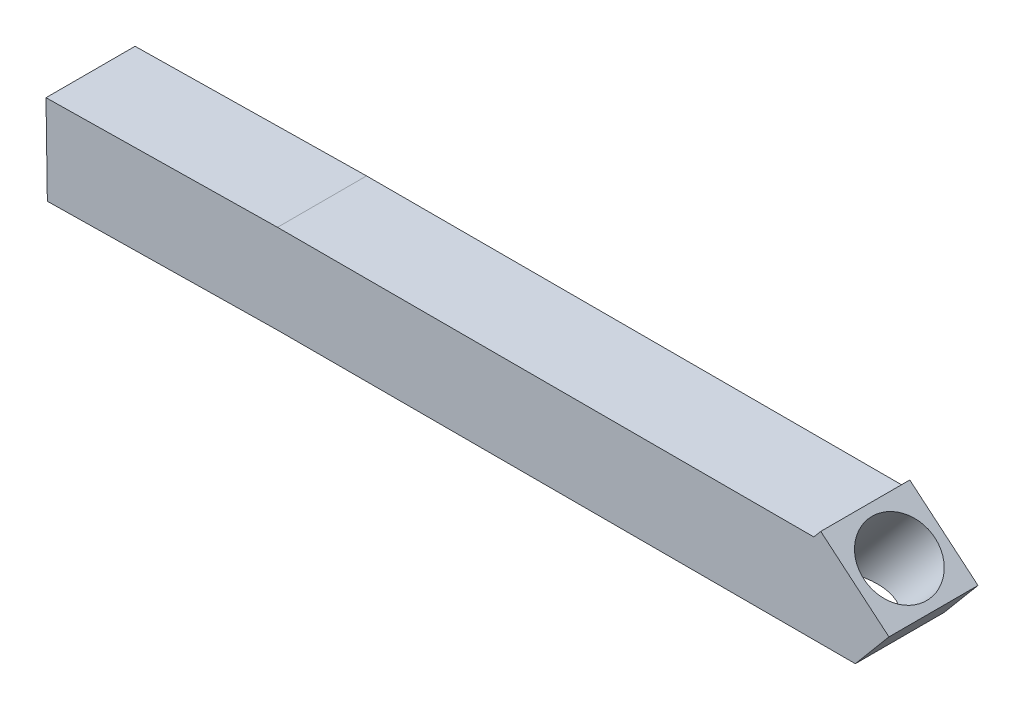
ISO-10303-21;
HEADER;
FILE_DESCRIPTION(('STEP AP214'),'2;1');
FILE_NAME('part.step','',(''),(''),'','','');
FILE_SCHEMA(('AUTOMOTIVE_DESIGN { 1 0 10303 214 1 1 1 1 }'));
ENDSEC;
DATA;
#1=APPLICATION_CONTEXT('core data for automotive mechanical design processes');
#2=APPLICATION_PROTOCOL_DEFINITION('international standard','automotive_design',2000,#1);
#3=PRODUCT_CONTEXT('',#1,'mechanical');
#4=PRODUCT('Part','Part','',(#3));
#5=PRODUCT_RELATED_PRODUCT_CATEGORY('part','',(#4));
#6=PRODUCT_DEFINITION_FORMATION('','',#4);
#7=PRODUCT_DEFINITION_CONTEXT('part definition',#1,'design');
#8=PRODUCT_DEFINITION('design','',#6,#7);
#9=PRODUCT_DEFINITION_SHAPE('','',#8);
#10=(LENGTH_UNIT() NAMED_UNIT(*) SI_UNIT(.MILLI.,.METRE.));
#11=(NAMED_UNIT(*) PLANE_ANGLE_UNIT() SI_UNIT($,.RADIAN.));
#12=(NAMED_UNIT(*) SI_UNIT($,.STERADIAN.) SOLID_ANGLE_UNIT());
#13=UNCERTAINTY_MEASURE_WITH_UNIT(LENGTH_MEASURE(1.E-05),#10,'distance_accuracy_value','');
#14=(GEOMETRIC_REPRESENTATION_CONTEXT(3) GLOBAL_UNCERTAINTY_ASSIGNED_CONTEXT((#13)) GLOBAL_UNIT_ASSIGNED_CONTEXT((#10,
#11,#12)) REPRESENTATION_CONTEXT('',''));
#15=CARTESIAN_POINT('',(0.,0.,0.));
#16=DIRECTION('',(0.,0.,1.));
#17=DIRECTION('',(1.,0.,0.));
#18=AXIS2_PLACEMENT_3D('',#15,#16,#17);
#19=CARTESIAN_POINT('',(0.,0.,2.5));
#20=DIRECTION('',(0.,0.,1.));
#21=DIRECTION('',(1.,0.,0.));
#22=AXIS2_PLACEMENT_3D('',#19,#20,#21);
#23=PLANE('',#22);
#24=DIRECTION('',(-1.,0.,0.));
#25=VECTOR('',#24,1.);
#26=CARTESIAN_POINT('',(-70.4061726678737,-77.7100601328562,2.5));
#27=LINE('',#26,#25);
#28=CARTESIAN_POINT('',(-55.3504965717444,-77.7100601328562,2.5));
#29=VERTEX_POINT('',#28);
#30=CARTESIAN_POINT('',(-70.4061726678737,-77.7100601328562,2.5));
#31=VERTEX_POINT('',#30);
#32=EDGE_CURVE('E150',#29,#31,#27,.T.);
#33=ORIENTED_EDGE('',*,*,#32,.T.);
#34=DIRECTION('',(0.999885535757896,0.0151299498394764,0.));
#35=VECTOR('',#34,1.);
#36=CARTESIAN_POINT('',(-76.9054286503,-77.8084048068128,2.5));
#37=LINE('',#36,#35);
#38=CARTESIAN_POINT('',(-76.9054286503,-77.8084048068128,2.5));
#39=VERTEX_POINT('',#38);
#40=EDGE_CURVE('E137',#39,#31,#37,.T.);
#41=ORIENTED_EDGE('',*,*,#40,.F.);
#42=DIRECTION('',(-0.0151299498394762,0.999885535757896,0.));
#43=VECTOR('',#42,1.);
#44=CARTESIAN_POINT('',(-76.9054286503,-77.8084048068128,2.5));
#45=LINE('',#44,#43);
#46=CARTESIAN_POINT('',(-76.8676037757013,-80.3081186462075,2.5));
#47=VERTEX_POINT('',#46);
#48=EDGE_CURVE('E117',#47,#39,#45,.T.);
#49=ORIENTED_EDGE('',*,*,#48,.F.);
#50=DIRECTION('',(0.999885535757896,0.0151299498394764,0.));
#51=VECTOR('',#50,1.);
#52=CARTESIAN_POINT('',(-76.8676037757013,-80.3081186462075,2.5));
#53=LINE('',#52,#51);
#54=CARTESIAN_POINT('',(-70.368347793275,-80.2097739722509,2.5));
#55=VERTEX_POINT('',#54);
#56=EDGE_CURVE('E114',#47,#55,#53,.T.);
#57=ORIENTED_EDGE('',*,*,#56,.T.);
#58=DIRECTION('',(1.,0.,0.));
#59=VECTOR('',#58,1.);
#60=CARTESIAN_POINT('',(-70.368347793275,-80.209773972251,2.5));
#61=LINE('',#60,#59);
#62=CARTESIAN_POINT('',(-54.1844873090986,-80.209773972251,2.5));
#63=VERTEX_POINT('',#62);
#64=EDGE_CURVE('E84',#55,#63,#61,.T.);
#65=ORIENTED_EDGE('',*,*,#64,.T.);
#66=DIRECTION('',(0.642787609686536,0.766044443118981,0.));
#67=VECTOR('',#66,1.);
#68=CARTESIAN_POINT('',(-54.1844873090986,-80.209773972251,2.5));
#69=LINE('',#68,#67);
#70=CARTESIAN_POINT('',(-53.2406469454359,-79.0849488280205,2.5));
#71=VERTEX_POINT('',#70);
#72=EDGE_CURVE('E144',#63,#71,#69,.T.);
#73=ORIENTED_EDGE('',*,*,#72,.T.);
#74=DIRECTION('',(-0.766044443118982,0.642787609686535,0.));
#75=VECTOR('',#74,1.);
#76=CARTESIAN_POINT('',(-53.2406469454359,-79.0849488280205,2.5));
#77=LINE('',#76,#75);
#78=CARTESIAN_POINT('',(-55.1557580532333,-77.4779798038041,2.5));
#79=VERTEX_POINT('',#78);
#80=EDGE_CURVE('E147',#71,#79,#77,.T.);
#81=ORIENTED_EDGE('',*,*,#80,.T.);
#82=DIRECTION('',(-0.642787609686532,-0.766044443118984,0.));
#83=VECTOR('',#82,1.);
#84=CARTESIAN_POINT('',(-55.3504965717444,-77.7100601328562,2.5));
#85=LINE('',#84,#83);
#86=EDGE_CURVE('E50',#79,#29,#85,.T.);
#87=ORIENTED_EDGE('',*,*,#86,.T.);
#88=EDGE_LOOP('',(#33,#41,#49,#57,#65,#73,#81,#87));
#89=FACE_BOUND('',#88,.T.);
#90=ADVANCED_FACE('F33',(#89),#23,.T.);
#91=CARTESIAN_POINT('',(0.,0.,0.));
#92=DIRECTION('',(0.,0.,1.));
#93=DIRECTION('',(1.,0.,0.));
#94=AXIS2_PLACEMENT_3D('',#91,#92,#93);
#95=PLANE('',#94);
#96=DIRECTION('',(1.,0.,0.));
#97=VECTOR('',#96,1.);
#98=CARTESIAN_POINT('',(-70.368347793275,-80.209773972251,0.));
#99=LINE('',#98,#97);
#100=CARTESIAN_POINT('',(-70.368347793275,-80.209773972251,0.));
#101=VERTEX_POINT('',#100);
#102=CARTESIAN_POINT('',(-54.1844873090986,-80.209773972251,0.));
#103=VERTEX_POINT('',#102);
#104=EDGE_CURVE('E131',#101,#103,#99,.T.);
#105=ORIENTED_EDGE('',*,*,#104,.F.);
#106=DIRECTION('',(0.999885535757896,0.0151299498394764,0.));
#107=VECTOR('',#106,1.);
#108=CARTESIAN_POINT('',(-76.8676037757013,-80.3081186462075,0.));
#109=LINE('',#108,#107);
#110=CARTESIAN_POINT('',(-76.8676037757013,-80.3081186462075,0.));
#111=VERTEX_POINT('',#110);
#112=EDGE_CURVE('E112',#111,#101,#109,.T.);
#113=ORIENTED_EDGE('',*,*,#112,.F.);
#114=DIRECTION('',(0.0151299498394762,-0.999885535757896,0.));
#115=VECTOR('',#114,1.);
#116=CARTESIAN_POINT('',(-76.9054286503,-77.8084048068128,0.));
#117=LINE('',#116,#115);
#118=CARTESIAN_POINT('',(-76.9054286503,-77.8084048068128,0.));
#119=VERTEX_POINT('',#118);
#120=EDGE_CURVE('E118',#119,#111,#117,.T.);
#121=ORIENTED_EDGE('',*,*,#120,.F.);
#122=DIRECTION('',(0.999885535757896,0.0151299498394764,0.));
#123=VECTOR('',#122,1.);
#124=CARTESIAN_POINT('',(-76.9054286503,-77.8084048068128,0.));
#125=LINE('',#124,#123);
#126=CARTESIAN_POINT('',(-70.4061726678737,-77.7100601328562,0.));
#127=VERTEX_POINT('',#126);
#128=EDGE_CURVE('E173',#119,#127,#125,.T.);
#129=ORIENTED_EDGE('',*,*,#128,.T.);
#130=DIRECTION('',(-1.,0.,0.));
#131=VECTOR('',#130,1.);
#132=CARTESIAN_POINT('',(-70.4061726678737,-77.7100601328562,0.));
#133=LINE('',#132,#131);
#134=CARTESIAN_POINT('',(-55.3504965717444,-77.7100601328562,0.));
#135=VERTEX_POINT('',#134);
#136=EDGE_CURVE('E145',#135,#127,#133,.T.);
#137=ORIENTED_EDGE('',*,*,#136,.F.);
#138=DIRECTION('',(-0.642787609686532,-0.766044443118984,0.));
#139=VECTOR('',#138,1.);
#140=CARTESIAN_POINT('',(-55.3504965717444,-77.7100601328562,0.));
#141=LINE('',#140,#139);
#142=CARTESIAN_POINT('',(-55.1557580532333,-77.4779798038041,0.));
#143=VERTEX_POINT('',#142);
#144=EDGE_CURVE('E77',#143,#135,#141,.T.);
#145=ORIENTED_EDGE('',*,*,#144,.F.);
#146=DIRECTION('',(-0.766044443118982,0.642787609686535,0.));
#147=VECTOR('',#146,1.);
#148=CARTESIAN_POINT('',(-53.2406469454359,-79.0849488280205,0.));
#149=LINE('',#148,#147);
#150=CARTESIAN_POINT('',(-53.2406469454359,-79.0849488280205,0.));
#151=VERTEX_POINT('',#150);
#152=EDGE_CURVE('E71',#151,#143,#149,.T.);
#153=ORIENTED_EDGE('',*,*,#152,.F.);
#154=DIRECTION('',(0.642787609686536,0.766044443118981,0.));
#155=VECTOR('',#154,1.);
#156=CARTESIAN_POINT('',(-54.1844873090986,-80.209773972251,0.));
#157=LINE('',#156,#155);
#158=EDGE_CURVE('E154',#103,#151,#157,.T.);
#159=ORIENTED_EDGE('',*,*,#158,.F.);
#160=EDGE_LOOP('',(#105,#113,#121,#129,#137,#145,#153,#159));
#161=FACE_BOUND('',#160,.T.);
#162=ADVANCED_FACE('F129',(#161),#95,.F.);
#163=CARTESIAN_POINT('',(-70.368347793275,-80.209773972251,2.5));
#164=DIRECTION('',(0.,1.,0.));
#165=DIRECTION('',(0.,0.,1.));
#166=AXIS2_PLACEMENT_3D('',#163,#164,#165);
#167=PLANE('',#166);
#168=CARTESIAN_POINT('',(-55.8162464207639,-80.209773972251,1.25));
#169=DIRECTION('',(0.,1.,0.));
#170=DIRECTION('',(1.,0.,0.));
#171=AXIS2_PLACEMENT_3D('',#168,#169,#170);
#172=ELLIPSE('',#171,1.3054072893277,0.999999999996499);
#173=CARTESIAN_POINT('',(-54.5108391314362,-80.209773972251,1.25));
#174=VERTEX_POINT('',#173);
#175=EDGE_CURVE('E135',#174,#174,#172,.T.);
#176=ORIENTED_EDGE('',*,*,#175,.T.);
#177=EDGE_LOOP('',(#176));
#178=FACE_BOUND('',#177,.T.);
#179=ORIENTED_EDGE('',*,*,#104,.T.);
#180=DIRECTION('',(0.,0.,-1.));
#181=VECTOR('',#180,1.);
#182=CARTESIAN_POINT('',(-54.1844873090986,-80.209773972251,2.5));
#183=LINE('',#182,#181);
#184=EDGE_CURVE('E42',#63,#103,#183,.T.);
#185=ORIENTED_EDGE('',*,*,#184,.F.);
#186=ORIENTED_EDGE('',*,*,#64,.F.);
#187=DIRECTION('',(0.,0.,-1.));
#188=VECTOR('',#187,1.);
#189=CARTESIAN_POINT('',(-70.368347793275,-80.209773972251,2.5));
#190=LINE('',#189,#188);
#191=EDGE_CURVE('E11',#55,#101,#190,.T.);
#192=ORIENTED_EDGE('',*,*,#191,.T.);
#193=EDGE_LOOP('',(#179,#185,#186,#192));
#194=FACE_BOUND('',#193,.T.);
#195=ADVANCED_FACE('F35',(#178,#194),#167,.F.);
#196=CARTESIAN_POINT('',(-54.1844873090986,-80.209773972251,2.5));
#197=DIRECTION('',(-0.766044443118981,0.642787609686536,0.));
#198=DIRECTION('',(-0.642787609686536,-0.766044443118981,0.));
#199=AXIS2_PLACEMENT_3D('',#196,#197,#198);
#200=PLANE('',#199);
#201=ORIENTED_EDGE('',*,*,#158,.T.);
#202=DIRECTION('',(0.,0.,-1.));
#203=VECTOR('',#202,1.);
#204=CARTESIAN_POINT('',(-53.2406469454359,-79.0849488280205,2.5));
#205=LINE('',#204,#203);
#206=EDGE_CURVE('E165',#71,#151,#205,.T.);
#207=ORIENTED_EDGE('',*,*,#206,.F.);
#208=ORIENTED_EDGE('',*,*,#72,.F.);
#209=ORIENTED_EDGE('',*,*,#184,.T.);
#210=EDGE_LOOP('',(#201,#207,#208,#209));
#211=FACE_BOUND('',#210,.T.);
#212=ADVANCED_FACE('F169',(#211),#200,.F.);
#213=CARTESIAN_POINT('',(-53.2406469454359,-79.0849488280205,2.5));
#214=DIRECTION('',(-0.642787609686535,-0.766044443118982,0.));
#215=DIRECTION('',(0.766044443118982,-0.642787609686535,0.));
#216=AXIS2_PLACEMENT_3D('',#213,#214,#215);
#217=PLANE('',#216);
#218=CARTESIAN_POINT('',(-54.1982024993346,-78.2814643159123,1.25));
#219=DIRECTION('',(0.642787609686535,0.766044443118981,0.));
#220=DIRECTION('',(-0.766044443118981,0.642787609686535,0.));
#221=AXIS2_PLACEMENT_3D('',#218,#219,#220);
#222=CIRCLE('',#221,0.999999999996499);
#223=CARTESIAN_POINT('',(-54.9642469424509,-77.6386767062281,1.25));
#224=VERTEX_POINT('',#223);
#225=EDGE_CURVE('E132',#224,#224,#222,.T.);
#226=ORIENTED_EDGE('',*,*,#225,.F.);
#227=EDGE_LOOP('',(#226));
#228=FACE_BOUND('',#227,.T.);
#229=ORIENTED_EDGE('',*,*,#152,.T.);
#230=DIRECTION('',(0.,0.,-1.));
#231=VECTOR('',#230,1.);
#232=CARTESIAN_POINT('',(-55.1557580532333,-77.4779798038041,2.5));
#233=LINE('',#232,#231);
#234=EDGE_CURVE('E163',#79,#143,#233,.T.);
#235=ORIENTED_EDGE('',*,*,#234,.F.);
#236=ORIENTED_EDGE('',*,*,#80,.F.);
#237=ORIENTED_EDGE('',*,*,#206,.T.);
#238=EDGE_LOOP('',(#229,#235,#236,#237));
#239=FACE_BOUND('',#238,.T.);
#240=ADVANCED_FACE('F180',(#228,#239),#217,.F.);
#241=CARTESIAN_POINT('',(-55.3504965717444,-77.7100601328562,2.5));
#242=DIRECTION('',(0.766044443118984,-0.642787609686532,0.));
#243=DIRECTION('',(0.642787609686532,0.766044443118984,0.));
#244=AXIS2_PLACEMENT_3D('',#241,#242,#243);
#245=PLANE('',#244);
#246=ORIENTED_EDGE('',*,*,#144,.T.);
#247=DIRECTION('',(0.,0.,-1.));
#248=VECTOR('',#247,1.);
#249=CARTESIAN_POINT('',(-55.3504965717444,-77.7100601328562,2.5));
#250=LINE('',#249,#248);
#251=EDGE_CURVE('E161',#29,#135,#250,.T.);
#252=ORIENTED_EDGE('',*,*,#251,.F.);
#253=ORIENTED_EDGE('',*,*,#86,.F.);
#254=ORIENTED_EDGE('',*,*,#234,.T.);
#255=EDGE_LOOP('',(#246,#252,#253,#254));
#256=FACE_BOUND('',#255,.T.);
#257=ADVANCED_FACE('F178',(#256),#245,.F.);
#258=CARTESIAN_POINT('',(-70.4061726678737,-77.7100601328562,2.5));
#259=DIRECTION('',(0.,-1.,0.));
#260=DIRECTION('',(0.,0.,-1.));
#261=AXIS2_PLACEMENT_3D('',#258,#259,#260);
#262=PLANE('',#261);
#263=ORIENTED_EDGE('',*,*,#136,.T.);
#264=DIRECTION('',(0.,0.,-1.));
#265=VECTOR('',#264,1.);
#266=CARTESIAN_POINT('',(-70.4061726678737,-77.7100601328562,2.5));
#267=LINE('',#266,#265);
#268=EDGE_CURVE('E152',#31,#127,#267,.T.);
#269=ORIENTED_EDGE('',*,*,#268,.F.);
#270=ORIENTED_EDGE('',*,*,#32,.F.);
#271=ORIENTED_EDGE('',*,*,#251,.T.);
#272=EDGE_LOOP('',(#263,#269,#270,#271));
#273=FACE_BOUND('',#272,.T.);
#274=ADVANCED_FACE('F176',(#273),#262,.F.);
#275=CARTESIAN_POINT('',(-57.090746742924,-81.7286643099478,1.25));
#276=DIRECTION('',(0.642787609686535,0.766044443118981,0.));
#277=DIRECTION('',(-0.766044443118982,0.642787609686535,0.));
#278=AXIS2_PLACEMENT_3D('',#275,#276,#277);
#279=CYLINDRICAL_SURFACE('',#278,0.999999999996499);
#280=ORIENTED_EDGE('',*,*,#225,.T.);
#281=EDGE_LOOP('',(#280));
#282=FACE_BOUND('',#281,.T.);
#283=ORIENTED_EDGE('',*,*,#175,.F.);
#284=EDGE_LOOP('',(#283));
#285=FACE_BOUND('',#284,.T.);
#286=ADVANCED_FACE('F189',(#282,#285),#279,.F.);
#287=CARTESIAN_POINT('',(-76.8676037757013,-80.3081186462075,0.));
#288=DIRECTION('',(-0.0151299498394764,0.999885535757896,0.));
#289=DIRECTION('',(-0.999885535757896,-0.0151299498394764,0.));
#290=AXIS2_PLACEMENT_3D('',#287,#288,#289);
#291=PLANE('',#290);
#292=ORIENTED_EDGE('',*,*,#191,.F.);
#293=ORIENTED_EDGE('',*,*,#56,.F.);
#294=DIRECTION('',(0.,0.,1.));
#295=VECTOR('',#294,1.);
#296=CARTESIAN_POINT('',(-76.8676037757013,-80.3081186462075,0.));
#297=LINE('',#296,#295);
#298=EDGE_CURVE('E108',#111,#47,#297,.T.);
#299=ORIENTED_EDGE('',*,*,#298,.F.);
#300=ORIENTED_EDGE('',*,*,#112,.T.);
#301=EDGE_LOOP('',(#292,#293,#299,#300));
#302=FACE_BOUND('',#301,.T.);
#303=ADVANCED_FACE('F110',(#302),#291,.F.);
#304=CARTESIAN_POINT('',(-76.9054286503,-77.8084048068128,0.));
#305=DIRECTION('',(0.0151299498394764,-0.999885535757896,0.));
#306=DIRECTION('',(0.999885535757896,0.0151299498394764,0.));
#307=AXIS2_PLACEMENT_3D('',#304,#305,#306);
#308=PLANE('',#307);
#309=ORIENTED_EDGE('',*,*,#268,.T.);
#310=ORIENTED_EDGE('',*,*,#128,.F.);
#311=DIRECTION('',(0.,0.,-1.));
#312=VECTOR('',#311,1.);
#313=CARTESIAN_POINT('',(-76.9054286503,-77.8084048068128,0.));
#314=LINE('',#313,#312);
#315=EDGE_CURVE('E123',#39,#119,#314,.T.);
#316=ORIENTED_EDGE('',*,*,#315,.F.);
#317=ORIENTED_EDGE('',*,*,#40,.T.);
#318=EDGE_LOOP('',(#309,#310,#316,#317));
#319=FACE_BOUND('',#318,.T.);
#320=ADVANCED_FACE('F210',(#319),#308,.F.);
#321=CARTESIAN_POINT('',(-78.0649263249573,-1.1812536308206,0.));
#322=DIRECTION('',(-0.999885535757896,-0.0151299498394762,0.));
#323=DIRECTION('',(0.0151299498394762,-0.999885535757896,0.));
#324=AXIS2_PLACEMENT_3D('',#321,#322,#323);
#325=PLANE('',#324);
#326=CARTESIAN_POINT('',(-76.8865162130007,-79.0582617265102,1.25));
#327=DIRECTION('',(-0.999885535757896,-0.0151299498394762,0.));
#328=DIRECTION('',(0.0151299498394762,-0.999885535757896,0.));
#329=AXIS2_PLACEMENT_3D('',#326,#327,#328);
#330=CIRCLE('',#329,1.);
#331=CARTESIAN_POINT('',(-76.8713862631612,-80.0581472622681,1.25));
#332=VERTEX_POINT('',#331);
#333=EDGE_CURVE('E231',#332,#332,#330,.T.);
#334=ORIENTED_EDGE('',*,*,#333,.F.);
#335=EDGE_LOOP('',(#334));
#336=FACE_BOUND('',#335,.T.);
#337=ORIENTED_EDGE('',*,*,#120,.T.);
#338=ORIENTED_EDGE('',*,*,#298,.T.);
#339=ORIENTED_EDGE('',*,*,#48,.T.);
#340=ORIENTED_EDGE('',*,*,#315,.T.);
#341=EDGE_LOOP('',(#337,#338,#339,#340));
#342=FACE_BOUND('',#341,.T.);
#343=ADVANCED_FACE('F121',(#336,#342),#325,.T.);
#344=CARTESIAN_POINT('',(-71.8870885342112,-78.9826119773128,1.25));
#345=DIRECTION('',(-0.999885535757896,-0.0151299498394762,0.));
#346=DIRECTION('',(0.0151299498394762,-0.999885535757896,0.));
#347=AXIS2_PLACEMENT_3D('',#344,#345,#346);
#348=CYLINDRICAL_SURFACE('',#347,1.);
#349=CARTESIAN_POINT('',(-71.8870885342112,-78.9826119773128,1.25));
#350=DIRECTION('',(-0.999885535757896,-0.0151299498394762,0.));
#351=DIRECTION('',(0.0151299498394762,-0.999885535757896,0.));
#352=AXIS2_PLACEMENT_3D('',#349,#350,#351);
#353=CIRCLE('',#352,1.);
#354=CARTESIAN_POINT('',(-71.8719585843717,-79.9824975130707,1.25));
#355=VERTEX_POINT('',#354);
#356=EDGE_CURVE('E127',#355,#355,#353,.T.);
#357=ORIENTED_EDGE('',*,*,#356,.F.);
#358=EDGE_LOOP('',(#357));
#359=FACE_BOUND('',#358,.T.);
#360=ORIENTED_EDGE('',*,*,#333,.T.);
#361=EDGE_LOOP('',(#360));
#362=FACE_BOUND('',#361,.T.);
#363=ADVANCED_FACE('F217',(#359,#362),#348,.F.);
#364=CARTESIAN_POINT('',(-71.8870885342112,-78.9826119773128,1.25));
#365=DIRECTION('',(-0.999885535757896,-0.0151299498394762,0.));
#366=DIRECTION('',(0.0151299498394762,-0.999885535757896,0.));
#367=AXIS2_PLACEMENT_3D('',#364,#365,#366);
#368=PLANE('',#367);
#369=ORIENTED_EDGE('',*,*,#356,.T.);
#370=EDGE_LOOP('',(#369));
#371=FACE_BOUND('',#370,.T.);
#372=ADVANCED_FACE('F223',(#371),#368,.T.);
#373=CLOSED_SHELL('',(#90,#162,#195,#212,#240,#257,#274,#286,#303,#320,#343,#363,#372));
#374=MANIFOLD_SOLID_BREP('B2',#373);
#375=ADVANCED_BREP_SHAPE_REPRESENTATION('',(#18,#374),#14);
#376=SHAPE_DEFINITION_REPRESENTATION(#9,#375);
ENDSEC;
END-ISO-10303-21;
